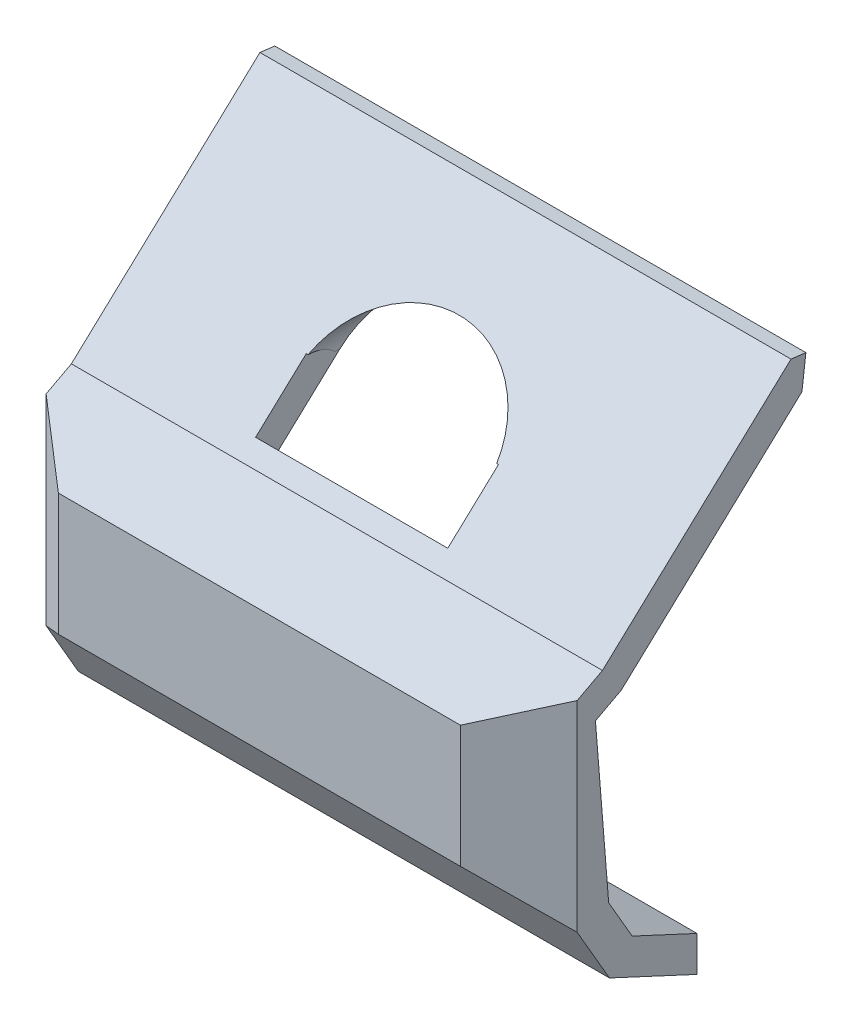
ISO-10303-21;
HEADER;
FILE_DESCRIPTION(('STEP AP214'),'2;1');
FILE_NAME('part.step','',(''),(''),'','','');
FILE_SCHEMA(('AUTOMOTIVE_DESIGN { 1 0 10303 214 1 1 1 1 }'));
ENDSEC;
DATA;
#1=APPLICATION_CONTEXT('core data for automotive mechanical design processes');
#2=APPLICATION_PROTOCOL_DEFINITION('international standard','automotive_design',2000,#1);
#3=PRODUCT_CONTEXT('',#1,'mechanical');
#4=PRODUCT('Part','Part','',(#3));
#5=PRODUCT_RELATED_PRODUCT_CATEGORY('part','',(#4));
#6=PRODUCT_DEFINITION_FORMATION('','',#4);
#7=PRODUCT_DEFINITION_CONTEXT('part definition',#1,'design');
#8=PRODUCT_DEFINITION('design','',#6,#7);
#9=PRODUCT_DEFINITION_SHAPE('','',#8);
#10=(LENGTH_UNIT() NAMED_UNIT(*) SI_UNIT(.MILLI.,.METRE.));
#11=(NAMED_UNIT(*) PLANE_ANGLE_UNIT() SI_UNIT($,.RADIAN.));
#12=(NAMED_UNIT(*) SI_UNIT($,.STERADIAN.) SOLID_ANGLE_UNIT());
#13=UNCERTAINTY_MEASURE_WITH_UNIT(LENGTH_MEASURE(1.E-05),#10,'distance_accuracy_value','');
#14=(GEOMETRIC_REPRESENTATION_CONTEXT(3) GLOBAL_UNCERTAINTY_ASSIGNED_CONTEXT((#13)) GLOBAL_UNIT_ASSIGNED_CONTEXT((#10,
#11,#12)) REPRESENTATION_CONTEXT('',''));
#15=CARTESIAN_POINT('',(0.,0.,0.));
#16=DIRECTION('',(0.,0.,1.));
#17=DIRECTION('',(1.,0.,0.));
#18=AXIS2_PLACEMENT_3D('',#15,#16,#17);
#19=CARTESIAN_POINT('',(0.,8.63210992560828,69.5870460778749));
#20=DIRECTION('',(0.,-0.1231041194093,-0.992393760452201));
#21=DIRECTION('',(0.,0.992393760452201,-0.1231041194093));
#22=AXIS2_PLACEMENT_3D('',#19,#20,#21);
#23=PLANE('',#22);
#24=DIRECTION('',(0.,0.992393760452201,-0.1231041194093));
#25=VECTOR('',#24,1.);
#26=CARTESIAN_POINT('',(0.,8.63210992560828,69.5870460778749));
#27=LINE('',#26,#25);
#28=CARTESIAN_POINT('',(0.,61.6000653723195,63.0164953831514));
#29=VERTEX_POINT('',#28);
#30=CARTESIAN_POINT('',(0.,71.5240029768415,61.7854541890585));
#31=VERTEX_POINT('',#30);
#32=EDGE_CURVE('E210',#29,#31,#27,.T.);
#33=ORIENTED_EDGE('',*,*,#32,.T.);
#34=DIRECTION('',(1.,0.,0.));
#35=VECTOR('',#34,1.);
#36=CARTESIAN_POINT('',(165.,71.5240029768415,61.7854541890585));
#37=LINE('',#36,#35);
#38=CARTESIAN_POINT('',(165.,71.5240029768415,61.7854541890585));
#39=VERTEX_POINT('',#38);
#40=EDGE_CURVE('E217',#31,#39,#37,.T.);
#41=ORIENTED_EDGE('',*,*,#40,.T.);
#42=DIRECTION('',(0.,0.992393760452201,-0.1231041194093));
#43=VECTOR('',#42,1.);
#44=CARTESIAN_POINT('',(165.,8.63210992560828,69.5870460778749));
#45=LINE('',#44,#43);
#46=CARTESIAN_POINT('',(165.,61.6000653723195,63.0164953831514));
#47=VERTEX_POINT('',#46);
#48=EDGE_CURVE('E216',#47,#39,#45,.T.);
#49=ORIENTED_EDGE('',*,*,#48,.F.);
#50=DIRECTION('',(-1.,0.,0.));
#51=VECTOR('',#50,1.);
#52=CARTESIAN_POINT('',(165.,61.6000653723195,63.0164953831514));
#53=LINE('',#52,#51);
#54=EDGE_CURVE('E201',#47,#29,#53,.T.);
#55=ORIENTED_EDGE('',*,*,#54,.T.);
#56=EDGE_LOOP('',(#33,#41,#49,#55));
#57=FACE_BOUND('',#56,.T.);
#58=ADVANCED_FACE('F44',(#57),#23,.T.);
#59=CARTESIAN_POINT('',(-61.9584865111273,0.,149.032892217914));
#60=DIRECTION('',(0.,0.,1.));
#61=DIRECTION('',(1.,0.,0.));
#62=AXIS2_PLACEMENT_3D('',#59,#60,#61);
#63=PLANE('',#62);
#64=DIRECTION('',(1.,0.,0.));
#65=VECTOR('',#64,1.);
#66=CARTESIAN_POINT('',(-61.9584865111273,4.86509725507391,149.032892217914));
#67=LINE('',#66,#65);
#68=CARTESIAN_POINT('',(20.,4.86509725507391,149.032892217914));
#69=VERTEX_POINT('',#68);
#70=CARTESIAN_POINT('',(144.913186348278,4.86509725507392,149.032892217914));
#71=VERTEX_POINT('',#70);
#72=EDGE_CURVE('E239',#69,#71,#67,.T.);
#73=ORIENTED_EDGE('',*,*,#72,.F.);
#74=DIRECTION('',(0.,1.,0.));
#75=VECTOR('',#74,1.);
#76=CARTESIAN_POINT('',(20.,-124.134902744926,149.032892217914));
#77=LINE('',#76,#75);
#78=CARTESIAN_POINT('',(20.,-33.1218671404479,149.032892217914));
#79=VERTEX_POINT('',#78);
#80=EDGE_CURVE('E250',#79,#69,#77,.T.);
#81=ORIENTED_EDGE('',*,*,#80,.F.);
#82=DIRECTION('',(1.,0.,0.));
#83=VECTOR('',#82,1.);
#84=CARTESIAN_POINT('',(-61.9584865111273,-33.1218671404479,149.032892217914));
#85=LINE('',#84,#83);
#86=CARTESIAN_POINT('',(144.913186348278,-33.1218671404479,149.032892217914));
#87=VERTEX_POINT('',#86);
#88=EDGE_CURVE('E235',#79,#87,#85,.T.);
#89=ORIENTED_EDGE('',*,*,#88,.T.);
#90=DIRECTION('',(0.,1.,0.));
#91=VECTOR('',#90,1.);
#92=CARTESIAN_POINT('',(144.913186348278,-124.134902744926,149.032892217914));
#93=LINE('',#92,#91);
#94=EDGE_CURVE('E246',#87,#71,#93,.T.);
#95=ORIENTED_EDGE('',*,*,#94,.T.);
#96=EDGE_LOOP('',(#73,#81,#89,#95));
#97=FACE_BOUND('',#96,.T.);
#98=ADVANCED_FACE('F451',(#97),#63,.T.);
#99=CARTESIAN_POINT('',(52.6473256665795,21.8768362377782,105.720840196026));
#100=DIRECTION('',(-1.,0.,0.));
#101=DIRECTION('',(0.,0.,1.));
#102=AXIS2_PLACEMENT_3D('',#99,#100,#101);
#103=CYLINDRICAL_SURFACE('',#102,14.682392189672);
#104=CARTESIAN_POINT('',(112.352674333421,32.6348018657095,95.7289026482033));
#105=CARTESIAN_POINT('',(112.352672071656,32.8201680755492,95.9284626250472));
#106=CARTESIAN_POINT('',(112.348952292558,32.9999397501922,96.133169543612));
#107=CARTESIAN_POINT('',(112.335415132606,33.3476229510203,96.5520003447025));
#108=CARTESIAN_POINT('',(112.325601855974,33.5155423754719,96.7661177987202));
#109=CARTESIAN_POINT('',(112.301213450057,33.8390756141588,97.2031290914104));
#110=CARTESIAN_POINT('',(112.286639065753,33.9946913488502,97.4260215522433));
#111=CARTESIAN_POINT('',(112.25402446063,34.2931422950685,97.8798137293214));
#112=CARTESIAN_POINT('',(112.235985765302,34.4359830915492,98.1107098846392));
#113=CARTESIAN_POINT('',(112.197671062281,34.7085916843391,98.5799487793312));
#114=CARTESIAN_POINT('',(112.177394779031,34.8383578667528,98.8182924332591));
#115=CARTESIAN_POINT('',(112.135774028494,35.0844605577729,99.3017378377656));
#116=CARTESIAN_POINT('',(112.114429507846,35.2007963945366,99.5468399256703));
#117=CARTESIAN_POINT('',(112.071778864639,35.4196361419409,100.042930682981));
#118=CARTESIAN_POINT('',(112.050472725411,35.5221501146059,100.293914912356));
#119=CARTESIAN_POINT('',(112.008881673011,35.7131508066219,100.801236611536));
#120=CARTESIAN_POINT('',(111.988596714068,35.8016381550595,101.057573840678));
#121=CARTESIAN_POINT('',(111.949941463634,35.9643226037817,101.574891672652));
#122=CARTESIAN_POINT('',(111.931571198829,36.0385195049033,101.835872340144));
#123=CARTESIAN_POINT('',(111.897539081734,36.1723173041842,102.361475108004));
#124=CARTESIAN_POINT('',(111.881874812324,36.2319312485299,102.626093728248));
#125=CARTESIAN_POINT('',(111.853879589815,36.3364381432468,103.158396259394));
#126=CARTESIAN_POINT('',(111.841548608058,36.381331220182,103.42608014392));
#127=CARTESIAN_POINT('',(111.820720365568,36.4562246718956,103.963651697033));
#128=CARTESIAN_POINT('',(111.812222767653,36.4862263565379,104.233539169665));
#129=CARTESIAN_POINT('',(111.799811516696,36.5297787811765,104.757273523338));
#130=CARTESIAN_POINT('',(111.795638461784,36.5442625085708,105.011037102687));
#131=CARTESIAN_POINT('',(111.79109020423,36.5600399117323,105.519005481891));
#132=CARTESIAN_POINT('',(111.790714928555,36.561333841147,105.773210273167));
#133=CARTESIAN_POINT('',(111.793775962491,36.5507270555873,106.281324878711));
#134=CARTESIAN_POINT('',(111.79721233832,36.5388261113857,106.535234687778));
#135=CARTESIAN_POINT('',(111.807791993078,36.5018125362096,107.042838641959));
#136=CARTESIAN_POINT('',(111.81494723959,36.4766572482185,107.296529426267));
#137=CARTESIAN_POINT('',(111.832725618125,36.4131950872268,107.802142190404));
#138=CARTESIAN_POINT('',(111.843348838882,36.3748878777169,108.054064124807));
#139=CARTESIAN_POINT('',(111.867660587885,36.2852583534683,108.555433665392));
#140=CARTESIAN_POINT('',(111.881349118057,36.2339360305607,108.804881270021));
#141=CARTESIAN_POINT('',(111.896369031873,36.1761743455597,109.052742068934));
#142=B_SPLINE_CURVE_WITH_KNOTS('',3,(#104,#105,#106,#107,#108,#109,#110,#111,#112,#113,#114,
#115,#116,#117,#118,#119,#120,#121,#122,#123,#124,#125,#126,#127,#128,#129,#130,#131,#132,#133,
#134,#135,#136,#137,#138,#139,#140,#141),.UNSPECIFIED.,.F.,.F.,(4,2,2,2,2,2,2,2,2,2,2,2,2,2,2,2,
2,2,4),(0.,0.816923810183565,1.63329798459609,2.44954448033324,3.26543236660944,
4.08142084083689,4.89745011658153,5.71288209533632,6.52827749205247,7.34368425194415,
8.15835884374771,8.9730264311283,9.78762234671563,10.5498893324283,11.3121416592731,
12.0744072285164,12.8391411501734,13.603894640014,14.3686486098485),.UNSPECIFIED.);
#143=CARTESIAN_POINT('',(112.352674333421,32.6348018657095,95.7289026482033));
#144=VERTEX_POINT('',#143);
#145=CARTESIAN_POINT('',(111.802345020581,36.5208690327273,104.660206464808));
#146=VERTEX_POINT('',#145);
#147=EDGE_CURVE('E322',#144,#146,#142,.T.);
#148=ORIENTED_EDGE('',*,*,#147,.F.);
#149=CARTESIAN_POINT('',(112.352674333421,21.8768362377782,105.720840196026));
#150=DIRECTION('',(-1.,0.,0.));
#151=DIRECTION('',(0.,0.,1.));
#152=AXIS2_PLACEMENT_3D('',#149,#150,#151);
#153=CIRCLE('',#152,14.682392189672);
#154=CARTESIAN_POINT('',(112.352674333421,36.5208690327273,104.660206464808));
#155=VERTEX_POINT('',#154);
#156=EDGE_CURVE('E329',#155,#144,#153,.T.);
#157=ORIENTED_EDGE('',*,*,#156,.F.);
#158=DIRECTION('',(-1.,0.,0.));
#159=VECTOR('',#158,1.);
#160=CARTESIAN_POINT('',(52.6473256665795,36.5208690327273,104.660206464808));
#161=LINE('',#160,#159);
#162=EDGE_CURVE('E311',#146,#155,#161,.F.);
#163=ORIENTED_EDGE('',*,*,#162,.F.);
#164=EDGE_LOOP('',(#148,#157,#163));
#165=FACE_BOUND('',#164,.T.);
#166=ADVANCED_FACE('F319',(#165),#103,.F.);
#167=CARTESIAN_POINT('',(52.6473256665795,21.8768362377782,105.720840196026));
#168=DIRECTION('',(-1.,0.,0.));
#169=DIRECTION('',(0.,0.,1.));
#170=AXIS2_PLACEMENT_3D('',#167,#168,#169);
#171=CIRCLE('',#170,14.682392189672);
#172=CARTESIAN_POINT('',(52.6473256665795,36.5208690327273,104.660206464808));
#173=VERTEX_POINT('',#172);
#174=CARTESIAN_POINT('',(52.6473256665795,32.6348018657095,95.7289026482033));
#175=VERTEX_POINT('',#174);
#176=EDGE_CURVE('E53',#173,#175,#171,.T.);
#177=ORIENTED_EDGE('',*,*,#176,.T.);
#178=CARTESIAN_POINT('',(53.1036309681266,36.1761743455597,109.052742068934));
#179=CARTESIAN_POINT('',(53.1194047874612,36.236822755242,108.792499596766));
#180=CARTESIAN_POINT('',(53.1337061087737,36.2903708800926,108.530506630212));
#181=CARTESIAN_POINT('',(53.1589071501156,36.3831128734368,108.003823100611));
#182=CARTESIAN_POINT('',(53.1698067669969,36.4223063066672,107.739132456014));
#183=CARTESIAN_POINT('',(53.187746679555,36.4861811677651,107.207875884508));
#184=CARTESIAN_POINT('',(53.1947870194368,36.5108627618551,106.941309979115));
#185=CARTESIAN_POINT('',(53.2047238793555,36.5455550726379,106.408164202321));
#186=CARTESIAN_POINT('',(53.207636024175,36.5556211111963,106.141588223202));
#187=CARTESIAN_POINT('',(53.2092525342385,36.5612184358432,105.608282333531));
#188=CARTESIAN_POINT('',(53.2079570856304,36.556750364935,105.341552430311));
#189=CARTESIAN_POINT('',(53.2012092790504,36.5332991417776,104.808793639699));
#190=CARTESIAN_POINT('',(53.1957570542441,36.5143164545155,104.542764730123));
#191=CARTESIAN_POINT('',(53.180898496392,36.4618850064951,104.011986253539));
#192=CARTESIAN_POINT('',(53.1714883059079,36.4284221324092,103.747238190144));
#193=CARTESIAN_POINT('',(53.1490783136234,36.3471523781133,103.220097119282));
#194=CARTESIAN_POINT('',(53.1360783617212,36.2993448980925,102.957704210768));
#195=CARTESIAN_POINT('',(53.1069993969292,36.1895578339924,102.436075409143));
#196=CARTESIAN_POINT('',(53.090920383125,36.1275782457034,102.176839516969));
#197=CARTESIAN_POINT('',(53.0563141675648,35.9896069939892,101.662097596491));
#198=CARTESIAN_POINT('',(53.0377852675507,35.9136055960805,101.406594293307));
#199=CARTESIAN_POINT('',(52.9990517099671,35.7478573700036,100.900219291716));
#200=CARTESIAN_POINT('',(52.9788470644247,35.658110640483,100.649347560084));
#201=CARTESIAN_POINT('',(52.9376305808493,35.4651276262511,100.152904743583));
#202=CARTESIAN_POINT('',(52.9166187120881,35.3618908276597,99.9073338610563));
#203=CARTESIAN_POINT('',(52.8749888162051,35.1434552688085,99.4249068573737));
#204=CARTESIAN_POINT('',(52.8543690238245,35.0284052371616,99.1879835332714));
#205=CARTESIAN_POINT('',(52.8142932445043,34.785694687595,98.7206010263185));
#206=CARTESIAN_POINT('',(52.794837189059,34.6580349131489,98.4901414633905));
#207=CARTESIAN_POINT('',(52.7581673259658,34.3904338634727,98.0363171155336));
#208=CARTESIAN_POINT('',(52.7409532397493,34.2504941176745,97.8129514517879));
#209=CARTESIAN_POINT('',(52.7098918855927,33.958602804267,97.3737980940251));
#210=CARTESIAN_POINT('',(52.696046343152,33.8066451331932,97.1580143319683));
#211=CARTESIAN_POINT('',(52.6729144004929,33.4911621160651,96.7347549999602));
#212=CARTESIAN_POINT('',(52.6636287083493,33.3276349779581,96.5272807249358));
#213=CARTESIAN_POINT('',(52.650833415285,32.9894341123661,96.1212175260155));
#214=CARTESIAN_POINT('',(52.6473275542625,32.8147532436074,95.9226344360212));
#215=CARTESIAN_POINT('',(52.6473256665795,32.6348018657095,95.7289026482033));
#216=B_SPLINE_CURVE_WITH_KNOTS('',3,(#178,#179,#180,#181,#182,#183,#184,#185,#186,#187,#188,
#189,#190,#191,#192,#193,#194,#195,#196,#197,#198,#199,#200,#201,#202,#203,#204,#205,#206,#207,
#208,#209,#210,#211,#212,#213,#214,#215),.UNSPECIFIED.,.F.,.F.,(4,2,2,2,2,2,2,2,2,2,2,2,2,2,2,2,
2,2,4),(0.,0.802949669995422,1.60592368503225,2.40888850240929,3.20880599341239,
4.00868809575907,4.8085445743308,5.6091824069946,6.40985372249775,7.21052527582211,
8.01175479242184,8.81297855902078,9.61423285571503,10.4064118999204,11.1985442649042,
11.9905781119329,12.7830168193679,13.5755785414759,14.368652897667),.UNSPECIFIED.);
#217=CARTESIAN_POINT('',(53.1976549794187,36.5208690327273,104.660206464808));
#218=VERTEX_POINT('',#217);
#219=EDGE_CURVE('E303',#218,#175,#216,.T.);
#220=ORIENTED_EDGE('',*,*,#219,.F.);
#221=EDGE_CURVE('E302',#173,#218,#161,.F.);
#222=ORIENTED_EDGE('',*,*,#221,.F.);
#223=EDGE_LOOP('',(#177,#220,#222));
#224=FACE_BOUND('',#223,.T.);
#225=ADVANCED_FACE('F318',(#224),#103,.F.);
#226=CARTESIAN_POINT('',(165.,-101.394528054744,47.1028238187657));
#227=DIRECTION('',(0.,0.906917412411711,-0.421308446467011));
#228=DIRECTION('',(0.,0.421308446467011,0.906917412411711));
#229=AXIS2_PLACEMENT_3D('',#226,#227,#228);
#230=PLANE('',#229);
#231=DIRECTION('',(0.,-0.421308446467011,-0.906917412411711));
#232=VECTOR('',#231,1.);
#233=CARTESIAN_POINT('',(0.,-101.394528054744,47.1028238187657));
#234=LINE('',#233,#232);
#235=CARTESIAN_POINT('',(0.,-66.2211876854406,122.817695194131));
#236=VERTEX_POINT('',#235);
#237=CARTESIAN_POINT('',(0.,-78.860441079451,95.6101728217795));
#238=VERTEX_POINT('',#237);
#239=EDGE_CURVE('E383',#236,#238,#234,.T.);
#240=ORIENTED_EDGE('',*,*,#239,.T.);
#241=DIRECTION('',(-1.,0.,0.));
#242=VECTOR('',#241,1.);
#243=CARTESIAN_POINT('',(165.,-78.860441079451,95.6101728217795));
#244=LINE('',#243,#242);
#245=CARTESIAN_POINT('',(165.,-78.860441079451,95.6101728217795));
#246=VERTEX_POINT('',#245);
#247=EDGE_CURVE('E357',#246,#238,#244,.T.);
#248=ORIENTED_EDGE('',*,*,#247,.F.);
#249=DIRECTION('',(0.,-0.421308446467011,-0.906917412411711));
#250=VECTOR('',#249,1.);
#251=CARTESIAN_POINT('',(165.,-101.394528054744,47.1028238187657));
#252=LINE('',#251,#250);
#253=CARTESIAN_POINT('',(165.,-66.2211876854406,122.817695194131));
#254=VERTEX_POINT('',#253);
#255=EDGE_CURVE('E407',#254,#246,#252,.T.);
#256=ORIENTED_EDGE('',*,*,#255,.F.);
#257=DIRECTION('',(-1.,0.,0.));
#258=VECTOR('',#257,1.);
#259=CARTESIAN_POINT('',(165.,-66.2211876854406,122.817695194131));
#260=LINE('',#259,#258);
#261=EDGE_CURVE('E354',#254,#236,#260,.T.);
#262=ORIENTED_EDGE('',*,*,#261,.T.);
#263=EDGE_LOOP('',(#240,#248,#256,#262));
#264=FACE_BOUND('',#263,.T.);
#265=ADVANCED_FACE('F420',(#264),#230,.F.);
#266=CARTESIAN_POINT('',(165.,0.,95.6101728217795));
#267=DIRECTION('',(0.,0.,1.));
#268=DIRECTION('',(1.,0.,0.));
#269=AXIS2_PLACEMENT_3D('',#266,#267,#268);
#270=PLANE('',#269);
#271=DIRECTION('',(0.,1.,0.));
#272=VECTOR('',#271,1.);
#273=CARTESIAN_POINT('',(0.,0.,95.6101728217795));
#274=LINE('',#273,#272);
#275=CARTESIAN_POINT('',(0.,-67.8340787413329,95.6101728217795));
#276=VERTEX_POINT('',#275);
#277=EDGE_CURVE('E380',#238,#276,#274,.T.);
#278=ORIENTED_EDGE('',*,*,#277,.T.);
#279=DIRECTION('',(-1.,0.,0.));
#280=VECTOR('',#279,1.);
#281=CARTESIAN_POINT('',(165.,-67.8340787413329,95.6101728217795));
#282=LINE('',#281,#280);
#283=CARTESIAN_POINT('',(165.,-67.8340787413329,95.6101728217795));
#284=VERTEX_POINT('',#283);
#285=EDGE_CURVE('E360',#284,#276,#282,.T.);
#286=ORIENTED_EDGE('',*,*,#285,.F.);
#287=DIRECTION('',(0.,1.,0.));
#288=VECTOR('',#287,1.);
#289=CARTESIAN_POINT('',(165.,0.,95.6101728217795));
#290=LINE('',#289,#288);
#291=EDGE_CURVE('E405',#246,#284,#290,.T.);
#292=ORIENTED_EDGE('',*,*,#291,.F.);
#293=ORIENTED_EDGE('',*,*,#247,.T.);
#294=EDGE_LOOP('',(#278,#286,#292,#293));
#295=FACE_BOUND('',#294,.T.);
#296=ADVANCED_FACE('F425',(#295),#270,.F.);
#297=CARTESIAN_POINT('',(165.,-92.3253539306265,42.8897393540957));
#298=DIRECTION('',(0.,0.906917412411711,-0.421308446467011));
#299=DIRECTION('',(0.,0.421308446467011,0.906917412411711));
#300=AXIS2_PLACEMENT_3D('',#297,#298,#299);
#301=PLANE('',#300);
#302=DIRECTION('',(0.,-0.421308446467011,-0.906917412411711));
#303=VECTOR('',#302,1.);
#304=CARTESIAN_POINT('',(0.,-92.3253539306265,42.8897393540957));
#305=LINE('',#304,#303);
#306=CARTESIAN_POINT('',(0.,-58.4803939904789,115.745111111994));
#307=VERTEX_POINT('',#306);
#308=EDGE_CURVE('E377',#307,#276,#305,.T.);
#309=ORIENTED_EDGE('',*,*,#308,.F.);
#310=DIRECTION('',(-1.,0.,0.));
#311=VECTOR('',#310,1.);
#312=CARTESIAN_POINT('',(165.,-58.4803939904789,115.745111111994));
#313=LINE('',#312,#311);
#314=CARTESIAN_POINT('',(165.,-58.4803939904789,115.745111111994));
#315=VERTEX_POINT('',#314);
#316=EDGE_CURVE('E362',#315,#307,#313,.T.);
#317=ORIENTED_EDGE('',*,*,#316,.F.);
#318=DIRECTION('',(0.,-0.421308446467011,-0.906917412411711));
#319=VECTOR('',#318,1.);
#320=CARTESIAN_POINT('',(165.,-92.3253539306265,42.8897393540957));
#321=LINE('',#320,#319);
#322=EDGE_CURVE('E402',#315,#284,#321,.T.);
#323=ORIENTED_EDGE('',*,*,#322,.T.);
#324=ORIENTED_EDGE('',*,*,#285,.T.);
#325=EDGE_LOOP('',(#309,#317,#323,#324));
#326=FACE_BOUND('',#325,.T.);
#327=ADVANCED_FACE('F440',(#326),#301,.T.);
#328=CARTESIAN_POINT('',(165.,-64.895833235521,112.028787064505));
#329=DIRECTION('',(0.,0.501250655049192,-0.865302132675493));
#330=DIRECTION('',(0.,0.865302132675493,0.501250655049192));
#331=AXIS2_PLACEMENT_3D('',#328,#329,#330);
#332=PLANE('',#331);
#333=DIRECTION('',(0.,-0.865302132675493,-0.501250655049192));
#334=VECTOR('',#333,1.);
#335=CARTESIAN_POINT('',(0.,-64.895833235521,112.028787064505));
#336=LINE('',#335,#334);
#337=CARTESIAN_POINT('',(0.,-45.8583562820263,123.056782296549));
#338=VERTEX_POINT('',#337);
#339=EDGE_CURVE('E374',#338,#307,#336,.T.);
#340=ORIENTED_EDGE('',*,*,#339,.F.);
#341=DIRECTION('',(-1.,0.,0.));
#342=VECTOR('',#341,1.);
#343=CARTESIAN_POINT('',(165.,-45.8583562820263,123.056782296549));
#344=LINE('',#343,#342);
#345=CARTESIAN_POINT('',(165.,-45.8583562820263,123.056782296549));
#346=VERTEX_POINT('',#345);
#347=EDGE_CURVE('E364',#346,#338,#344,.T.);
#348=ORIENTED_EDGE('',*,*,#347,.F.);
#349=DIRECTION('',(0.,-0.865302132675493,-0.501250655049192));
#350=VECTOR('',#349,1.);
#351=CARTESIAN_POINT('',(165.,-64.895833235521,112.028787064505));
#352=LINE('',#351,#350);
#353=EDGE_CURVE('E399',#346,#315,#352,.T.);
#354=ORIENTED_EDGE('',*,*,#353,.T.);
#355=ORIENTED_EDGE('',*,*,#316,.T.);
#356=EDGE_LOOP('',(#340,#348,#354,#355));
#357=FACE_BOUND('',#356,.T.);
#358=ADVANCED_FACE('F432',(#357),#332,.T.);
#359=CARTESIAN_POINT('',(165.,-10.1575084043734,125.936267837819));
#360=DIRECTION('',(0.,0.0803948670012249,-0.996763093899376));
#361=DIRECTION('',(0.,0.996763093899376,0.0803948670012249));
#362=AXIS2_PLACEMENT_3D('',#359,#360,#361);
#363=PLANE('',#362);
#364=DIRECTION('',(0.,-0.996763093899376,-0.0803948670012249));
#365=VECTOR('',#364,1.);
#366=CARTESIAN_POINT('',(0.,-10.1575084043734,125.936267837819));
#367=LINE('',#366,#365);
#368=CARTESIAN_POINT('',(0.,5.13679618067758,127.169844392285));
#369=VERTEX_POINT('',#368);
#370=EDGE_CURVE('E371',#369,#338,#367,.T.);
#371=ORIENTED_EDGE('',*,*,#370,.F.);
#372=DIRECTION('',(-1.,0.,0.));
#373=VECTOR('',#372,1.);
#374=CARTESIAN_POINT('',(165.,5.13679618067758,127.169844392285));
#375=LINE('',#374,#373);
#376=CARTESIAN_POINT('',(165.,5.13679618067758,127.169844392285));
#377=VERTEX_POINT('',#376);
#378=EDGE_CURVE('E366',#377,#369,#375,.T.);
#379=ORIENTED_EDGE('',*,*,#378,.F.);
#380=DIRECTION('',(0.,-0.996763093899376,-0.0803948670012249));
#381=VECTOR('',#380,1.);
#382=CARTESIAN_POINT('',(165.,-10.1575084043734,125.936267837819));
#383=LINE('',#382,#381);
#384=EDGE_CURVE('E396',#377,#346,#383,.T.);
#385=ORIENTED_EDGE('',*,*,#384,.T.);
#386=ORIENTED_EDGE('',*,*,#347,.T.);
#387=EDGE_LOOP('',(#371,#379,#385,#386));
#388=FACE_BOUND('',#387,.T.);
#389=ADVANCED_FACE('F436',(#388),#363,.T.);
#390=CARTESIAN_POINT('',(165.,-69.9083397860127,120.68180839126));
#391=DIRECTION('',(0.,0.50125065504919,-0.865302132675494));
#392=DIRECTION('',(0.,0.865302132675494,0.50125065504919));
#393=AXIS2_PLACEMENT_3D('',#390,#391,#392);
#394=PLANE('',#393);
#395=DIRECTION('',(0.,-0.865302132675494,-0.50125065504919));
#396=VECTOR('',#395,1.);
#397=CARTESIAN_POINT('',(0.,-69.9083397860127,120.68180839126));
#398=LINE('',#397,#396);
#399=CARTESIAN_POINT('',(0.,-48.9151450319308,132.842708295115));
#400=VERTEX_POINT('',#399);
#401=EDGE_CURVE('E385',#400,#236,#398,.T.);
#402=ORIENTED_EDGE('',*,*,#401,.T.);
#403=ORIENTED_EDGE('',*,*,#261,.F.);
#404=DIRECTION('',(0.,-0.865302132675494,-0.50125065504919));
#405=VECTOR('',#404,1.);
#406=CARTESIAN_POINT('',(165.,-69.9083397860127,120.68180839126));
#407=LINE('',#406,#405);
#408=CARTESIAN_POINT('',(165.,-48.9151450319308,132.842708295115));
#409=VERTEX_POINT('',#408);
#410=EDGE_CURVE('E231',#409,#254,#407,.T.);
#411=ORIENTED_EDGE('',*,*,#410,.F.);
#412=DIRECTION('',(-1.,0.,0.));
#413=VECTOR('',#412,1.);
#414=CARTESIAN_POINT('',(165.,-48.9151450319308,132.842708295115));
#415=LINE('',#414,#413);
#416=EDGE_CURVE('E351',#409,#400,#415,.T.);
#417=ORIENTED_EDGE('',*,*,#416,.T.);
#418=EDGE_LOOP('',(#402,#403,#411,#417));
#419=FACE_BOUND('',#418,.T.);
#420=ADVANCED_FACE('F416',(#419),#394,.F.);
#421=CARTESIAN_POINT('',(165.,71.7729255698193,66.7625830710969));
#422=DIRECTION('',(0.,-0.732201639747454,-0.681087922922686));
#423=DIRECTION('',(0.,0.681087922922686,-0.732201639747454));
#424=AXIS2_PLACEMENT_3D('',#421,#422,#423);
#425=PLANE('',#424);
#426=DIRECTION('',(0.,-0.681087922922686,0.732201639747454));
#427=VECTOR('',#426,1.);
#428=CARTESIAN_POINT('',(0.,71.7729255698193,66.7625830710969));
#429=LINE('',#428,#427);
#430=CARTESIAN_POINT('',(0.,72.0980469131513,66.4130622930995));
#431=VERTEX_POINT('',#430);
#432=CARTESIAN_POINT('',(0.,17.6110130793364,124.989193472896));
#433=VERTEX_POINT('',#432);
#434=EDGE_CURVE('E390',#431,#433,#429,.T.);
#435=ORIENTED_EDGE('',*,*,#434,.T.);
#436=DIRECTION('',(-1.,0.,0.));
#437=VECTOR('',#436,1.);
#438=CARTESIAN_POINT('',(165.,17.6110130793364,124.989193472896));
#439=LINE('',#438,#437);
#440=CARTESIAN_POINT('',(165.,17.6110130793364,124.989193472896));
#441=VERTEX_POINT('',#440);
#442=EDGE_CURVE('E348',#441,#433,#439,.T.);
#443=ORIENTED_EDGE('',*,*,#442,.F.);
#444=DIRECTION('',(0.,-0.681087922922686,0.732201639747454));
#445=VECTOR('',#444,1.);
#446=CARTESIAN_POINT('',(165.,71.7729255698193,66.7625830710969));
#447=LINE('',#446,#445);
#448=CARTESIAN_POINT('',(165.,72.0980469131513,66.4130622930995));
#449=VERTEX_POINT('',#448);
#450=EDGE_CURVE('E223',#449,#441,#447,.T.);
#451=ORIENTED_EDGE('',*,*,#450,.F.);
#452=DIRECTION('',(-1.,0.,0.));
#453=VECTOR('',#452,1.);
#454=CARTESIAN_POINT('',(165.,72.0980469131513,66.4130622930995));
#455=LINE('',#454,#453);
#456=EDGE_CURVE('E345',#449,#431,#455,.T.);
#457=ORIENTED_EDGE('',*,*,#456,.T.);
#458=EDGE_LOOP('',(#435,#443,#451,#457));
#459=FACE_BOUND('',#458,.T.);
#460=DIRECTION('',(0.,0.681087922922686,-0.732201639747454));
#461=VECTOR('',#460,1.);
#462=CARTESIAN_POINT('',(52.6473256665795,71.7729255698193,66.7625830710969));
#463=LINE('',#462,#461);
#464=CARTESIAN_POINT('',(52.6473256665795,21.8768362377782,120.403232385698));
#465=VERTEX_POINT('',#464);
#466=EDGE_CURVE('E465',#465,#173,#463,.T.);
#467=ORIENTED_EDGE('',*,*,#466,.T.);
#468=ORIENTED_EDGE('',*,*,#221,.T.);
#469=CARTESIAN_POINT('',(82.5,32.6348018657095,108.837911950539));
#470=DIRECTION('',(0.,0.732201639747454,0.681087922922686));
#471=DIRECTION('',(0.,-0.681087922922686,0.732201639747454));
#472=AXIS2_PLACEMENT_3D('',#469,#470,#471);
#473=CIRCLE('',#472,29.8526743334205);
#474=EDGE_CURVE('E252',#146,#218,#473,.T.);
#475=ORIENTED_EDGE('',*,*,#474,.F.);
#476=ORIENTED_EDGE('',*,*,#162,.T.);
#477=DIRECTION('',(0.,0.681087922922686,-0.732201639747454));
#478=VECTOR('',#477,1.);
#479=CARTESIAN_POINT('',(112.352674333421,71.7729255698193,66.7625830710969));
#480=LINE('',#479,#478);
#481=CARTESIAN_POINT('',(112.352674333421,21.8768362377782,120.403232385698));
#482=VERTEX_POINT('',#481);
#483=EDGE_CURVE('E67',#482,#155,#480,.T.);
#484=ORIENTED_EDGE('',*,*,#483,.F.);
#485=DIRECTION('',(-1.,0.,0.));
#486=VECTOR('',#485,1.);
#487=CARTESIAN_POINT('',(165.,21.8768362377782,120.403232385698));
#488=LINE('',#487,#486);
#489=EDGE_CURVE('E60',#482,#465,#488,.T.);
#490=ORIENTED_EDGE('',*,*,#489,.T.);
#491=EDGE_LOOP('',(#467,#468,#475,#476,#484,#490));
#492=FACE_BOUND('',#491,.T.);
#493=ADVANCED_FACE('F482',(#459,#492),#425,.F.);
#494=CARTESIAN_POINT('',(165.,56.6355742005934,30.0233449551565));
#495=DIRECTION('',(0.,-0.88353099972498,-0.468372685502664));
#496=DIRECTION('',(0.,0.468372685502664,-0.88353099972498));
#497=AXIS2_PLACEMENT_3D('',#494,#495,#496);
#498=PLANE('',#497);
#499=DIRECTION('',(0.,-0.468372685502664,0.88353099972498));
#500=VECTOR('',#499,1.);
#501=CARTESIAN_POINT('',(0.,56.6355742005934,30.0233449551565));
#502=LINE('',#501,#500);
#503=CARTESIAN_POINT('',(0.,9.39232742056805,119.142275989772));
#504=VERTEX_POINT('',#503);
#505=EDGE_CURVE('E206',#504,#369,#502,.T.);
#506=ORIENTED_EDGE('',*,*,#505,.F.);
#507=DIRECTION('',(-1.,0.,0.));
#508=VECTOR('',#507,1.);
#509=CARTESIAN_POINT('',(165.,9.39232742056805,119.142275989772));
#510=LINE('',#509,#508);
#511=CARTESIAN_POINT('',(165.,9.39232742056805,119.142275989772));
#512=VERTEX_POINT('',#511);
#513=EDGE_CURVE('E202',#512,#504,#510,.T.);
#514=ORIENTED_EDGE('',*,*,#513,.F.);
#515=DIRECTION('',(0.,-0.468372685502664,0.88353099972498));
#516=VECTOR('',#515,1.);
#517=CARTESIAN_POINT('',(165.,56.6355742005934,30.0233449551565));
#518=LINE('',#517,#516);
#519=EDGE_CURVE('E393',#512,#377,#518,.T.);
#520=ORIENTED_EDGE('',*,*,#519,.T.);
#521=ORIENTED_EDGE('',*,*,#378,.T.);
#522=EDGE_LOOP('',(#506,#514,#520,#521));
#523=FACE_BOUND('',#522,.T.);
#524=ADVANCED_FACE('F439',(#523),#498,.T.);
#525=CARTESIAN_POINT('',(165.,0.,0.));
#526=DIRECTION('',(1.,0.,0.));
#527=DIRECTION('',(0.,0.,-1.));
#528=AXIS2_PLACEMENT_3D('',#525,#526,#527);
#529=PLANE('',#528);
#530=DIRECTION('',(0.,-0.681087922922686,0.732201639747454));
#531=VECTOR('',#530,1.);
#532=CARTESIAN_POINT('',(165.,64.4509091723448,59.95170384187));
#533=LINE('',#532,#531);
#534=EDGE_CURVE('E368',#47,#512,#533,.T.);
#535=ORIENTED_EDGE('',*,*,#534,.F.);
#536=ORIENTED_EDGE('',*,*,#48,.T.);
#537=DIRECTION('',(0.,0.1231041194093,0.992393760452201));
#538=VECTOR('',#537,1.);
#539=CARTESIAN_POINT('',(165.,62.8918930512332,-7.80159188881644));
#540=LINE('',#539,#538);
#541=EDGE_CURVE('E207',#39,#449,#540,.T.);
#542=ORIENTED_EDGE('',*,*,#541,.T.);
#543=ORIENTED_EDGE('',*,*,#450,.T.);
#544=DIRECTION('',(0.,-0.468372685502664,0.88353099972498));
#545=VECTOR('',#544,1.);
#546=CARTESIAN_POINT('',(165.,65.4708841978432,34.7070718101832));
#547=LINE('',#546,#545);
#548=CARTESIAN_POINT('',(165.,13.4477501841323,132.842708295115));
#549=VERTEX_POINT('',#548);
#550=EDGE_CURVE('E226',#441,#549,#547,.T.);
#551=ORIENTED_EDGE('',*,*,#550,.T.);
#552=DIRECTION('',(0.,1.,0.));
#553=VECTOR('',#552,1.);
#554=CARTESIAN_POINT('',(165.,-124.134902744926,132.842708295115));
#555=LINE('',#554,#553);
#556=EDGE_CURVE('E249',#409,#549,#555,.T.);
#557=ORIENTED_EDGE('',*,*,#556,.F.);
#558=ORIENTED_EDGE('',*,*,#410,.T.);
#559=ORIENTED_EDGE('',*,*,#255,.T.);
#560=ORIENTED_EDGE('',*,*,#291,.T.);
#561=ORIENTED_EDGE('',*,*,#322,.F.);
#562=ORIENTED_EDGE('',*,*,#353,.F.);
#563=ORIENTED_EDGE('',*,*,#384,.F.);
#564=ORIENTED_EDGE('',*,*,#519,.F.);
#565=EDGE_LOOP('',(#535,#536,#542,#543,#551,#557,#558,#559,#560,#561,#562,#563,#564));
#566=FACE_BOUND('',#565,.T.);
#567=ADVANCED_FACE('F411',(#566),#529,.T.);
#568=CARTESIAN_POINT('',(-61.9584865111273,-91.465401990972,89.223106913899));
#569=DIRECTION('',(0.,-0.715826666332414,0.698278013235003));
#570=DIRECTION('',(0.,-0.698278013235003,-0.715826666332414));
#571=AXIS2_PLACEMENT_3D('',#568,#569,#570);
#572=PLANE('',#571);
#573=ORIENTED_EDGE('',*,*,#88,.F.);
#574=DIRECTION('',(-0.662429742601364,-0.523096850424339,-0.536242968432433));
#575=VECTOR('',#574,1.);
#576=CARTESIAN_POINT('',(-57.4271964190813,-94.2633286106966,86.3548646853323));
#577=LINE('',#576,#575);
#578=EDGE_CURVE('E334',#79,#400,#577,.T.);
#579=ORIENTED_EDGE('',*,*,#578,.T.);
#580=ORIENTED_EDGE('',*,*,#416,.F.);
#581=DIRECTION('',(-0.664038775295844,0.522101169991595,0.535222265229132));
#582=VECTOR('',#581,1.);
#583=CARTESIAN_POINT('',(95.1779731633832,5.98249537519914,189.119999255622));
#584=LINE('',#583,#582);
#585=EDGE_CURVE('E340',#409,#87,#584,.T.);
#586=ORIENTED_EDGE('',*,*,#585,.T.);
#587=EDGE_LOOP('',(#573,#579,#580,#586));
#588=FACE_BOUND('',#587,.T.);
#589=ADVANCED_FACE('F560',(#588),#572,.T.);
#590=CARTESIAN_POINT('',(0.,0.,0.));
#591=DIRECTION('',(1.,0.,0.));
#592=DIRECTION('',(0.,0.,-1.));
#593=AXIS2_PLACEMENT_3D('',#590,#591,#592);
#594=PLANE('',#593);
#595=ORIENTED_EDGE('',*,*,#32,.F.);
#596=DIRECTION('',(0.,-0.681087922922686,0.732201639747454));
#597=VECTOR('',#596,1.);
#598=CARTESIAN_POINT('',(0.,64.4509091723448,59.95170384187));
#599=LINE('',#598,#597);
#600=EDGE_CURVE('E196',#29,#504,#599,.T.);
#601=ORIENTED_EDGE('',*,*,#600,.T.);
#602=ORIENTED_EDGE('',*,*,#505,.T.);
#603=ORIENTED_EDGE('',*,*,#370,.T.);
#604=ORIENTED_EDGE('',*,*,#339,.T.);
#605=ORIENTED_EDGE('',*,*,#308,.T.);
#606=ORIENTED_EDGE('',*,*,#277,.F.);
#607=ORIENTED_EDGE('',*,*,#239,.F.);
#608=ORIENTED_EDGE('',*,*,#401,.F.);
#609=DIRECTION('',(0.,1.,0.));
#610=VECTOR('',#609,1.);
#611=CARTESIAN_POINT('',(0.,-124.134902744926,132.842708295115));
#612=LINE('',#611,#610);
#613=CARTESIAN_POINT('',(0.,13.4477501841323,132.842708295115));
#614=VERTEX_POINT('',#613);
#615=EDGE_CURVE('E245',#400,#614,#612,.T.);
#616=ORIENTED_EDGE('',*,*,#615,.T.);
#617=DIRECTION('',(0.,-0.468372685502664,0.88353099972498));
#618=VECTOR('',#617,1.);
#619=CARTESIAN_POINT('',(0.,65.4708841978432,34.7070718101832));
#620=LINE('',#619,#618);
#621=EDGE_CURVE('E387',#433,#614,#620,.T.);
#622=ORIENTED_EDGE('',*,*,#621,.F.);
#623=ORIENTED_EDGE('',*,*,#434,.F.);
#624=DIRECTION('',(0.,0.1231041194093,0.992393760452201));
#625=VECTOR('',#624,1.);
#626=CARTESIAN_POINT('',(0.,62.8918930512332,-7.80159188881644));
#627=LINE('',#626,#625);
#628=EDGE_CURVE('E48',#31,#431,#627,.T.);
#629=ORIENTED_EDGE('',*,*,#628,.F.);
#630=EDGE_LOOP('',(#595,#601,#602,#603,#604,#605,#606,#607,#608,#616,#622,#623,#629));
#631=FACE_BOUND('',#630,.T.);
#632=ADVANCED_FACE('F211',(#631),#594,.F.);
#633=CARTESIAN_POINT('',(165.,65.4708841978432,34.7070718101832));
#634=DIRECTION('',(0.,-0.88353099972498,-0.468372685502664));
#635=DIRECTION('',(0.,0.468372685502664,-0.88353099972498));
#636=AXIS2_PLACEMENT_3D('',#633,#634,#635);
#637=PLANE('',#636);
#638=DIRECTION('',(-0.737317988749738,0.316407219789522,-0.596865692372335));
#639=VECTOR('',#638,1.);
#640=CARTESIAN_POINT('',(34.3761080744465,-1.30416004860662,160.67048390888));
#641=LINE('',#640,#639);
#642=EDGE_CURVE('E238',#69,#614,#641,.T.);
#643=ORIENTED_EDGE('',*,*,#642,.F.);
#644=ORIENTED_EDGE('',*,*,#72,.T.);
#645=DIRECTION('',(-0.738773402137084,-0.315661598384908,0.595459163671098));
#646=VECTOR('',#645,1.);
#647=CARTESIAN_POINT('',(220.30270753861,37.0773787091336,88.2681420148069));
#648=LINE('',#647,#646);
#649=EDGE_CURVE('E243',#549,#71,#648,.T.);
#650=ORIENTED_EDGE('',*,*,#649,.F.);
#651=ORIENTED_EDGE('',*,*,#550,.F.);
#652=ORIENTED_EDGE('',*,*,#442,.T.);
#653=ORIENTED_EDGE('',*,*,#621,.T.);
#654=EDGE_LOOP('',(#643,#644,#650,#651,#652,#653));
#655=FACE_BOUND('',#654,.T.);
#656=ADVANCED_FACE('F493',(#655),#637,.F.);
#657=CARTESIAN_POINT('',(0.,-124.134902744926,132.842708295115));
#658=DIRECTION('',(-0.629191367010384,0.,0.777250425332533));
#659=DIRECTION('',(0.777250425332534,0.,0.629191367010384));
#660=AXIS2_PLACEMENT_3D('',#657,#658,#659);
#661=PLANE('',#660);
#662=ORIENTED_EDGE('',*,*,#642,.T.);
#663=ORIENTED_EDGE('',*,*,#615,.F.);
#664=ORIENTED_EDGE('',*,*,#578,.F.);
#665=ORIENTED_EDGE('',*,*,#80,.T.);
#666=EDGE_LOOP('',(#662,#663,#664,#665));
#667=FACE_BOUND('',#666,.T.);
#668=ADVANCED_FACE('F286',(#667),#661,.T.);
#669=CARTESIAN_POINT('',(165.,-124.134902744926,132.842708295115));
#670=DIRECTION('',(0.627544356375244,0.,0.778580811978809));
#671=DIRECTION('',(0.778580811978809,0.,-0.627544356375244));
#672=AXIS2_PLACEMENT_3D('',#669,#670,#671);
#673=PLANE('',#672);
#674=ORIENTED_EDGE('',*,*,#649,.T.);
#675=ORIENTED_EDGE('',*,*,#94,.F.);
#676=ORIENTED_EDGE('',*,*,#585,.F.);
#677=ORIENTED_EDGE('',*,*,#556,.T.);
#678=EDGE_LOOP('',(#674,#675,#676,#677));
#679=FACE_BOUND('',#678,.T.);
#680=ADVANCED_FACE('F630',(#679),#673,.T.);
#681=CARTESIAN_POINT('',(0.,0.,73.0328922179139));
#682=DIRECTION('',(0.,0.,1.));
#683=DIRECTION('',(1.,0.,0.));
#684=AXIS2_PLACEMENT_3D('',#681,#682,#683);
#685=PLANE('',#684);
#686=CARTESIAN_POINT('',(82.5,32.6348018657095,73.0328922179139));
#687=DIRECTION('',(0.,0.,1.));
#688=DIRECTION('',(1.,0.,0.));
#689=AXIS2_PLACEMENT_3D('',#686,#687,#688);
#690=ELLIPSE('',#689,29.8526743334205,20.3322959554368);
#691=CARTESIAN_POINT('',(90.1791392359204,52.282895695247,73.0328922179139));
#692=VERTEX_POINT('',#691);
#693=CARTESIAN_POINT('',(74.8208607640797,52.282895695247,73.0328922179139));
#694=VERTEX_POINT('',#693);
#695=EDGE_CURVE('E292',#692,#694,#690,.T.);
#696=ORIENTED_EDGE('',*,*,#695,.T.);
#697=DIRECTION('',(-1.,0.,0.));
#698=VECTOR('',#697,1.);
#699=CARTESIAN_POINT('',(165.,52.282895695247,73.0328922179139));
#700=LINE('',#699,#698);
#701=EDGE_CURVE('E332',#692,#694,#700,.T.);
#702=ORIENTED_EDGE('',*,*,#701,.F.);
#703=EDGE_LOOP('',(#696,#702));
#704=FACE_BOUND('',#703,.T.);
#705=ADVANCED_FACE('F284',(#704),#685,.T.);
#706=DIRECTION('',(0.,0.,1.));
#707=VECTOR('',#706,1.);
#708=SURFACE_OF_LINEAR_EXTRUSION('',#690,#707);
#709=ORIENTED_EDGE('',*,*,#474,.T.);
#710=ORIENTED_EDGE('',*,*,#219,.T.);
#711=DIRECTION('',(0.,0.,1.));
#712=VECTOR('',#711,1.);
#713=CARTESIAN_POINT('',(52.6473256665795,32.6348018657095,73.0328922179139));
#714=LINE('',#713,#712);
#715=CARTESIAN_POINT('',(52.6473256665795,32.6348018657095,94.1555197608666));
#716=VERTEX_POINT('',#715);
#717=EDGE_CURVE('E297',#716,#175,#714,.T.);
#718=ORIENTED_EDGE('',*,*,#717,.F.);
#719=CARTESIAN_POINT('',(52.6473256665795,32.6348018657095,94.1555197608666));
#720=CARTESIAN_POINT('',(52.6473251795664,32.9165486724249,93.8526286554344));
#721=CARTESIAN_POINT('',(52.6559251023034,33.1982650705869,93.5497702406312));
#722=CARTESIAN_POINT('',(52.6903016288237,33.7612047108092,92.9445835770932));
#723=CARTESIAN_POINT('',(52.7160778320941,34.0424279642152,92.6422553161612));
#724=CARTESIAN_POINT('',(52.819118260909,34.8845903214918,91.7368910626219));
#725=CARTESIAN_POINT('',(52.9220943310045,35.4441618534743,91.135325274294));
#726=CARTESIAN_POINT('',(53.1959380758059,36.55556082252,89.9405189649165));
#727=CARTESIAN_POINT('',(53.3668076204705,37.1073880458518,89.347278673638));
#728=CARTESIAN_POINT('',(53.6730490989002,37.9263003842321,88.4669092869686));
#729=CARTESIAN_POINT('',(53.7834578306406,38.1978103592616,88.1750232584052));
#730=CARTESIAN_POINT('',(54.0207675828149,38.7375397844402,87.5947886707181));
#731=CARTESIAN_POINT('',(54.1476727042875,39.0057583981428,87.3064410108138));
#732=CARTESIAN_POINT('',(54.5527402678422,39.8045834591084,86.4476663947547));
#733=CARTESIAN_POINT('',(54.8553234528273,40.3295423256045,85.883310854285));
#734=CARTESIAN_POINT('',(55.5234673500328,41.3605271562781,84.7749535362833));
#735=CARTESIAN_POINT('',(55.8890280635033,41.8665531200797,84.2309517591554));
#736=CARTESIAN_POINT('',(56.4826148313976,42.608708330508,83.433099905182));
#737=CARTESIAN_POINT('',(56.688057320759,42.8533201207667,83.1701306938643));
#738=CARTESIAN_POINT('',(57.1136316715151,43.3364577785907,82.6507349251588));
#739=CARTESIAN_POINT('',(57.3337598635879,43.5749851459535,82.394306755418));
#740=CARTESIAN_POINT('',(58.0157364195146,44.2809447131655,81.6353669250214));
#741=CARTESIAN_POINT('',(58.4992163713724,44.7388038859029,81.1431467200101));
#742=CARTESIAN_POINT('',(59.5202659411387,45.6255360524659,80.1898678194122));
#743=CARTESIAN_POINT('',(60.0578353209906,46.0544091738501,79.7288089866941));
#744=CARTESIAN_POINT('',(61.1834318143811,46.8802948088711,78.8409429772496));
#745=CARTESIAN_POINT('',(61.7714597892391,47.2773067784196,78.4141363854437));
#746=CARTESIAN_POINT('',(62.9938936280906,48.0367047133986,77.5977477893481));
#747=CARTESIAN_POINT('',(63.6283004110135,48.3990899924226,77.2081665229779));
#748=CARTESIAN_POINT('',(64.9390817618033,49.0867141771778,76.4689380934864));
#749=CARTESIAN_POINT('',(65.6154539476502,49.4119551883026,76.1192886669678));
#750=CARTESIAN_POINT('',(66.9566985902762,50.0016039355866,75.485388453639));
#751=CARTESIAN_POINT('',(67.6190472452742,50.2686789838063,75.1982701805636));
#752=CARTESIAN_POINT('',(68.9720026660865,50.7671869591475,74.6623505956064));
#753=CARTESIAN_POINT('',(69.6626082608331,50.9986213614538,74.4135476978315));
#754=CARTESIAN_POINT('',(71.0855855869352,51.429799431223,73.9500109368898));
#755=CARTESIAN_POINT('',(71.818569057634,51.6286108303292,73.7362793061755));
#756=CARTESIAN_POINT('',(72.9335192860898,51.8967119207908,73.4480579892982));
#757=CARTESIAN_POINT('',(73.3078115336506,51.9810710429873,73.3573679542512));
#758=CARTESIAN_POINT('',(74.0610060416463,52.1396293907296,73.1869102522348));
#759=CARTESIAN_POINT('',(74.4399082943358,52.2138286333424,73.1071425669174));
#760=CARTESIAN_POINT('',(74.8208607640796,52.282895695247,73.0328922179139));
#761=B_SPLINE_CURVE_WITH_KNOTS('',3,(#719,#720,#721,#722,#723,#724,#725,#726,#727,#728,#729,
#730,#731,#732,#733,#734,#735,#736,#737,#738,#739,#740,#741,#742,#743,#744,#745,#746,#747,#748,
#749,#750,#751,#752,#753,#754,#755,#756,#757,#758,#759,#760),.UNSPECIFIED.,.F.,.F.,(4,2,2,2,2,2,
2,2,2,2,2,2,2,2,2,2,2,2,2,2,4),(0.,1.24083662244544,2.48164431234275,4.9626457195123,
7.44371546449461,8.68434892151673,9.92529139470975,12.4063462395615,14.8874011336629,
16.1283561290172,17.3690022162872,19.8500468251551,22.3310805150092,24.8121565641009,
27.2932817854823,29.774266303043,32.0811483350063,34.3879348582517,36.7521431463562,
37.9346373627775,39.1171295927621),.UNSPECIFIED.);
#762=EDGE_CURVE('E268',#716,#694,#761,.T.);
#763=ORIENTED_EDGE('',*,*,#762,.T.);
#764=ORIENTED_EDGE('',*,*,#695,.F.);
#765=CARTESIAN_POINT('',(90.1791392359204,52.282895695247,73.0328922179139));
#766=CARTESIAN_POINT('',(90.5788910236974,52.2104209270171,73.110806011937));
#767=CARTESIAN_POINT('',(90.9763873397443,52.1322934490843,73.1947967354934));
#768=CARTESIAN_POINT('',(91.7662619296183,51.9648601506618,73.3747954280662));
#769=CARTESIAN_POINT('',(92.1586403211405,51.8755545877333,73.4708031201924));
#770=CARTESIAN_POINT('',(93.3270207938216,51.5911033755927,73.7766015890065));
#771=CARTESIAN_POINT('',(94.0944685780056,51.3793868513562,74.0042068378888));
#772=CARTESIAN_POINT('',(95.6009125441718,50.9132618404333,74.5053132087968));
#773=CARTESIAN_POINT('',(96.339907943298,50.6588521800927,74.778815592556));
#774=CARTESIAN_POINT('',(97.423030975933,50.246641083144,75.2219619631638));
#775=CARTESIAN_POINT('',(97.7798580665184,50.1041313353868,75.3751666632854));
#776=CARTESIAN_POINT('',(98.4845997677027,49.8091040677574,75.6923348905555));
#777=CARTESIAN_POINT('',(98.8325121707065,49.6565841016709,75.8563010474997));
#778=CARTESIAN_POINT('',(99.8617056601324,49.1844992758057,76.3638145005574));
#779=CARTESIAN_POINT('',(100.528692312419,48.850314589456,76.7230787997593));
#780=CARTESIAN_POINT('',(101.81961722447,48.1453591149628,77.4809391831265));
#781=CARTESIAN_POINT('',(102.443554595555,47.7745875719281,77.8795360788353));
#782=CARTESIAN_POINT('',(103.343869723445,47.1929909750928,78.5047798506627));
#783=CARTESIAN_POINT('',(103.638092203372,46.9948479837828,78.7177929114715));
#784=CARTESIAN_POINT('',(104.214102172725,46.5904739635951,79.1525140549358));
#785=CARTESIAN_POINT('',(104.495893617958,46.3842455476993,79.3742193285126));
#786=CARTESIAN_POINT('',(105.322099187011,45.7537967621144,80.0519815072944));
#787=CARTESIAN_POINT('',(105.847366716158,45.3177985282823,80.5207001719404));
#788=CARTESIAN_POINT('',(106.842847583873,44.4176752640725,81.4883751340819));
#789=CARTESIAN_POINT('',(107.313061185008,43.9535503678538,81.9873312873502));
#790=CARTESIAN_POINT('',(108.195335684741,43.0002339522158,83.0121913960612));
#791=CARTESIAN_POINT('',(108.607397123925,42.5110426658725,83.5380951009362));
#792=CARTESIAN_POINT('',(109.179608568214,41.7611747048125,84.3442385256003));
#793=CARTESIAN_POINT('',(109.362716913498,41.5085092726969,84.6158657817535));
#794=CARTESIAN_POINT('',(109.713315775642,40.9982894196369,85.1643761876335));
#795=CARTESIAN_POINT('',(109.880810743588,40.7407364174037,85.4412578121788));
#796=CARTESIAN_POINT('',(110.359622126081,39.9610947639319,86.279409360422));
#797=CARTESIAN_POINT('',(110.647186616545,39.4321262371686,86.8480754747893));
#798=CARTESIAN_POINT('',(111.141365827497,38.3922658983969,87.965974382598));
#799=CARTESIAN_POINT('',(111.351823791817,37.8822149520491,88.514303205796));
#800=CARTESIAN_POINT('',(111.713735142668,36.8522940530053,89.6215167471168));
#801=CARTESIAN_POINT('',(111.865167776914,36.3324207141577,90.1804051055122));
#802=CARTESIAN_POINT('',(112.108378069329,35.2844531056435,91.3070197106627));
#803=CARTESIAN_POINT('',(112.19996012013,34.7563375988012,91.8747687883833));
#804=CARTESIAN_POINT('',(112.291570251797,33.9619108384015,92.728815023894));
#805=CARTESIAN_POINT('',(112.314479803267,33.6967398654992,93.0138863262));
#806=CARTESIAN_POINT('',(112.345031778662,33.1659891176504,93.5844684122902));
#807=CARTESIAN_POINT('',(112.352674138595,32.9004093409951,93.8699791979115));
#808=CARTESIAN_POINT('',(112.352674333421,32.6348018657095,94.1555197608666));
#809=B_SPLINE_CURVE_WITH_KNOTS('',3,(#765,#766,#767,#768,#769,#770,#771,#772,#773,#774,#775,
#776,#777,#778,#779,#780,#781,#782,#783,#784,#785,#786,#787,#788,#789,#790,#791,#792,#793,#794,
#795,#796,#797,#798,#799,#800,#801,#802,#803,#804,#805,#806,#807,#808),.UNSPECIFIED.,.F.,.F.,(4,
2,2,2,2,2,2,2,2,2,2,2,2,2,2,2,2,2,2,2,2,4),(0.,1.2408379215738,2.48164725749696,
4.96264572141727,7.44371240032073,8.68434974260919,9.92529139859917,12.4063206673662,
14.88740113755,16.1283837531896,17.3689685715836,19.8500468072328,22.3311132095245,
24.8121565461856,26.0529568866248,27.2934024090638,29.7748020074568,32.1061661203329,
34.4383491627607,36.7781167686666,37.9478817060456,39.1176515465393),.UNSPECIFIED.);
#810=CARTESIAN_POINT('',(112.352674333421,32.6348018657095,94.1555197608666));
#811=VERTEX_POINT('',#810);
#812=EDGE_CURVE('E259',#692,#811,#809,.T.);
#813=ORIENTED_EDGE('',*,*,#812,.T.);
#814=DIRECTION('',(0.,0.,1.));
#815=VECTOR('',#814,1.);
#816=CARTESIAN_POINT('',(112.352674333421,32.6348018657095,73.0328922179139));
#817=LINE('',#816,#815);
#818=EDGE_CURVE('E298',#811,#144,#817,.T.);
#819=ORIENTED_EDGE('',*,*,#818,.T.);
#820=ORIENTED_EDGE('',*,*,#147,.T.);
#821=EDGE_LOOP('',(#709,#710,#718,#763,#764,#813,#819,#820));
#822=FACE_BOUND('',#821,.T.);
#823=ADVANCED_FACE('F277',(#822),#708,.F.);
#824=CARTESIAN_POINT('',(112.352674333421,0.,73.0328922179139));
#825=DIRECTION('',(-1.,0.,0.));
#826=DIRECTION('',(0.,0.,1.));
#827=AXIS2_PLACEMENT_3D('',#824,#825,#826);
#828=PLANE('',#827);
#829=ORIENTED_EDGE('',*,*,#818,.F.);
#830=DIRECTION('',(0.,0.681087922922686,-0.732201639747454));
#831=VECTOR('',#830,1.);
#832=CARTESIAN_POINT('',(112.352674333421,64.4509091723448,59.95170384187));
#833=LINE('',#832,#831);
#834=CARTESIAN_POINT('',(112.352674333421,11.8768362377783,116.471311832719));
#835=VERTEX_POINT('',#834);
#836=EDGE_CURVE('E475',#835,#811,#833,.T.);
#837=ORIENTED_EDGE('',*,*,#836,.F.);
#838=EDGE_CURVE('E330',#835,#482,#153,.T.);
#839=ORIENTED_EDGE('',*,*,#838,.T.);
#840=ORIENTED_EDGE('',*,*,#483,.T.);
#841=ORIENTED_EDGE('',*,*,#156,.T.);
#842=EDGE_LOOP('',(#829,#837,#839,#840,#841));
#843=FACE_BOUND('',#842,.T.);
#844=ADVANCED_FACE('F283',(#843),#828,.T.);
#845=DIRECTION('',(-1.,0.,0.));
#846=VECTOR('',#845,1.);
#847=CARTESIAN_POINT('',(52.6473256665795,11.8768362377783,116.471311832719));
#848=LINE('',#847,#846);
#849=CARTESIAN_POINT('',(52.6473256665795,11.8768362377783,116.471311832719));
#850=VERTEX_POINT('',#849);
#851=EDGE_CURVE('E296',#835,#850,#848,.T.);
#852=ORIENTED_EDGE('',*,*,#851,.T.);
#853=EDGE_CURVE('E11',#850,#465,#171,.T.);
#854=ORIENTED_EDGE('',*,*,#853,.T.);
#855=ORIENTED_EDGE('',*,*,#489,.F.);
#856=ORIENTED_EDGE('',*,*,#838,.F.);
#857=EDGE_LOOP('',(#852,#854,#855,#856));
#858=FACE_BOUND('',#857,.T.);
#859=ADVANCED_FACE('F313',(#858),#103,.F.);
#860=CARTESIAN_POINT('',(52.6473256665795,0.,73.0328922179139));
#861=DIRECTION('',(-1.,0.,0.));
#862=DIRECTION('',(0.,0.,1.));
#863=AXIS2_PLACEMENT_3D('',#860,#861,#862);
#864=PLANE('',#863);
#865=ORIENTED_EDGE('',*,*,#717,.T.);
#866=ORIENTED_EDGE('',*,*,#176,.F.);
#867=ORIENTED_EDGE('',*,*,#466,.F.);
#868=ORIENTED_EDGE('',*,*,#853,.F.);
#869=DIRECTION('',(0.,0.681087922922686,-0.732201639747454));
#870=VECTOR('',#869,1.);
#871=CARTESIAN_POINT('',(52.6473256665795,64.4509091723448,59.95170384187));
#872=LINE('',#871,#870);
#873=EDGE_CURVE('E467',#850,#716,#872,.T.);
#874=ORIENTED_EDGE('',*,*,#873,.T.);
#875=EDGE_LOOP('',(#865,#866,#867,#868,#874));
#876=FACE_BOUND('',#875,.T.);
#877=ADVANCED_FACE('F288',(#876),#864,.F.);
#878=CARTESIAN_POINT('',(165.,64.4509091723448,59.95170384187));
#879=DIRECTION('',(0.,-0.732201639747454,-0.681087922922686));
#880=DIRECTION('',(0.,0.681087922922686,-0.732201639747454));
#881=AXIS2_PLACEMENT_3D('',#878,#879,#880);
#882=PLANE('',#881);
#883=ORIENTED_EDGE('',*,*,#873,.F.);
#884=ORIENTED_EDGE('',*,*,#851,.F.);
#885=ORIENTED_EDGE('',*,*,#836,.T.);
#886=ORIENTED_EDGE('',*,*,#812,.F.);
#887=ORIENTED_EDGE('',*,*,#701,.T.);
#888=ORIENTED_EDGE('',*,*,#762,.F.);
#889=EDGE_LOOP('',(#883,#884,#885,#886,#887,#888));
#890=FACE_BOUND('',#889,.T.);
#891=ORIENTED_EDGE('',*,*,#600,.F.);
#892=ORIENTED_EDGE('',*,*,#54,.F.);
#893=ORIENTED_EDGE('',*,*,#534,.T.);
#894=ORIENTED_EDGE('',*,*,#513,.T.);
#895=EDGE_LOOP('',(#891,#892,#893,#894));
#896=FACE_BOUND('',#895,.T.);
#897=ADVANCED_FACE('F198',(#890,#896),#882,.T.);
#898=CARTESIAN_POINT('',(165.,62.8918930512332,-7.80159188881644));
#899=DIRECTION('',(0.,-0.992393760452201,0.1231041194093));
#900=DIRECTION('',(0.,-0.1231041194093,-0.992393760452201));
#901=AXIS2_PLACEMENT_3D('',#898,#899,#900);
#902=PLANE('',#901);
#903=ORIENTED_EDGE('',*,*,#40,.F.);
#904=ORIENTED_EDGE('',*,*,#628,.T.);
#905=ORIENTED_EDGE('',*,*,#456,.F.);
#906=ORIENTED_EDGE('',*,*,#541,.F.);
#907=EDGE_LOOP('',(#903,#904,#905,#906));
#908=FACE_BOUND('',#907,.T.);
#909=ADVANCED_FACE('F46',(#908),#902,.F.);
#910=CLOSED_SHELL('',(#58,#98,#166,#225,#265,#296,#327,#358,#389,#420,#493,#524,#567,#589,#632,
#656,#668,#680,#705,#823,#844,#859,#877,#897,#909));
#911=MANIFOLD_SOLID_BREP('B2',#910);
#912=ADVANCED_BREP_SHAPE_REPRESENTATION('',(#18,#911),#14);
#913=SHAPE_DEFINITION_REPRESENTATION(#9,#912);
ENDSEC;
END-ISO-10303-21;
